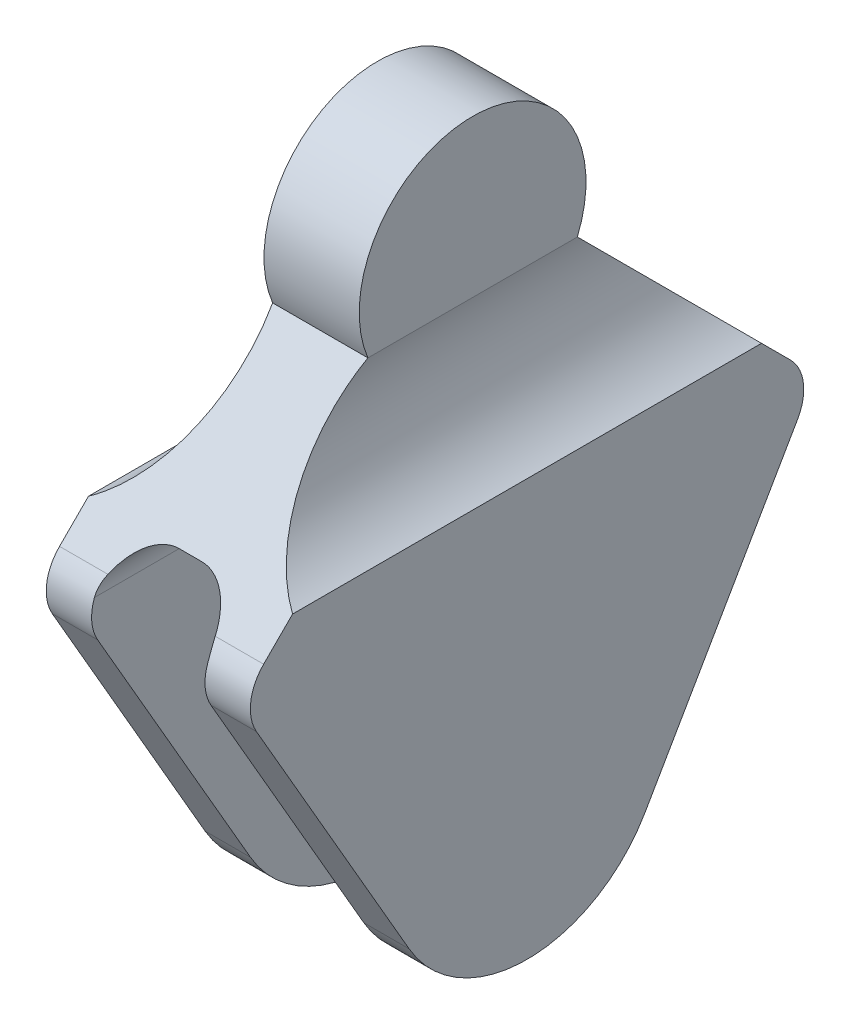
ISO-10303-21;
HEADER;
FILE_DESCRIPTION(('STEP AP214'),'2;1');
FILE_NAME('part.step','',(''),(''),'','','');
FILE_SCHEMA(('AUTOMOTIVE_DESIGN { 1 0 10303 214 1 1 1 1 }'));
ENDSEC;
DATA;
#1=APPLICATION_CONTEXT('core data for automotive mechanical design processes');
#2=APPLICATION_PROTOCOL_DEFINITION('international standard','automotive_design',2000,#1);
#3=PRODUCT_CONTEXT('',#1,'mechanical');
#4=PRODUCT('Part','Part','',(#3));
#5=PRODUCT_RELATED_PRODUCT_CATEGORY('part','',(#4));
#6=PRODUCT_DEFINITION_FORMATION('','',#4);
#7=PRODUCT_DEFINITION_CONTEXT('part definition',#1,'design');
#8=PRODUCT_DEFINITION('design','',#6,#7);
#9=PRODUCT_DEFINITION_SHAPE('','',#8);
#10=(LENGTH_UNIT() NAMED_UNIT(*) SI_UNIT(.MILLI.,.METRE.));
#11=(NAMED_UNIT(*) PLANE_ANGLE_UNIT() SI_UNIT($,.RADIAN.));
#12=(NAMED_UNIT(*) SI_UNIT($,.STERADIAN.) SOLID_ANGLE_UNIT());
#13=UNCERTAINTY_MEASURE_WITH_UNIT(LENGTH_MEASURE(1.E-05),#10,'distance_accuracy_value','');
#14=(GEOMETRIC_REPRESENTATION_CONTEXT(3) GLOBAL_UNCERTAINTY_ASSIGNED_CONTEXT((#13)) GLOBAL_UNIT_ASSIGNED_CONTEXT((#10,
#11,#12)) REPRESENTATION_CONTEXT('',''));
#15=CARTESIAN_POINT('',(0.,0.,0.));
#16=DIRECTION('',(0.,0.,1.));
#17=DIRECTION('',(1.,0.,0.));
#18=AXIS2_PLACEMENT_3D('',#15,#16,#17);
#19=CARTESIAN_POINT('',(-45.,-40.0000000000002,-69.2820323027552));
#20=DIRECTION('',(0.,-0.500000000000001,-0.866025403784438));
#21=DIRECTION('',(0.,0.866025403784438,-0.500000000000002));
#22=AXIS2_PLACEMENT_3D('',#19,#20,#21);
#23=PLANE('',#22);
#24=DIRECTION('',(0.,0.866025403784438,-0.500000000000002));
#25=VECTOR('',#24,1.);
#26=CARTESIAN_POINT('',(-35.,-40.0000000000002,-69.2820323027552));
#27=LINE('',#26,#25);
#28=CARTESIAN_POINT('',(-35.,-115.,-25.9807621135331));
#29=VERTEX_POINT('',#28);
#30=CARTESIAN_POINT('',(-35.,-56.6452466459918,-59.6718946709642));
#31=VERTEX_POINT('',#30);
#32=EDGE_CURVE('E248',#29,#31,#27,.T.);
#33=ORIENTED_EDGE('',*,*,#32,.F.);
#34=DIRECTION('',(1.,0.,0.));
#35=VECTOR('',#34,1.);
#36=CARTESIAN_POINT('',(-45.,-115.,-25.9807621135331));
#37=LINE('',#36,#35);
#38=CARTESIAN_POINT('',(-45.,-115.,-25.9807621135331));
#39=VERTEX_POINT('',#38);
#40=EDGE_CURVE('E65',#39,#29,#37,.T.);
#41=ORIENTED_EDGE('',*,*,#40,.F.);
#42=DIRECTION('',(0.,0.866025403784438,-0.500000000000001));
#43=VECTOR('',#42,1.);
#44=CARTESIAN_POINT('',(-45.,-40.0000000000002,-69.2820323027552));
#45=LINE('',#44,#43);
#46=CARTESIAN_POINT('',(-45.,-56.6452466459918,-59.6718946709642));
#47=VERTEX_POINT('',#46);
#48=EDGE_CURVE('E174',#39,#47,#45,.T.);
#49=ORIENTED_EDGE('',*,*,#48,.T.);
#50=DIRECTION('',(1.,0.,0.));
#51=VECTOR('',#50,1.);
#52=CARTESIAN_POINT('',(-45.,-56.6452466459918,-59.6718946709642));
#53=LINE('',#52,#51);
#54=EDGE_CURVE('E103',#47,#31,#53,.T.);
#55=ORIENTED_EDGE('',*,*,#54,.T.);
#56=EDGE_LOOP('',(#33,#41,#49,#55));
#57=FACE_BOUND('',#56,.T.);
#58=ADVANCED_FACE('F41',(#57),#23,.T.);
#59=CARTESIAN_POINT('',(-45.,-100.,0.));
#60=DIRECTION('',(1.,0.,0.));
#61=DIRECTION('',(0.,0.,-1.));
#62=AXIS2_PLACEMENT_3D('',#59,#60,#61);
#63=CYLINDRICAL_SURFACE('',#62,30.);
#64=ORIENTED_EDGE('',*,*,#40,.T.);
#65=CARTESIAN_POINT('',(-35.,-100.,0.));
#66=DIRECTION('',(-1.,0.,0.));
#67=DIRECTION('',(0.,0.,1.));
#68=AXIS2_PLACEMENT_3D('',#65,#66,#67);
#69=CIRCLE('',#68,30.);
#70=CARTESIAN_POINT('',(-35.,-115.,25.9807621135331));
#71=VERTEX_POINT('',#70);
#72=EDGE_CURVE('E332',#29,#71,#69,.T.);
#73=ORIENTED_EDGE('',*,*,#72,.T.);
#74=DIRECTION('',(1.,0.,0.));
#75=VECTOR('',#74,1.);
#76=CARTESIAN_POINT('',(-45.,-115.,25.9807621135331));
#77=LINE('',#76,#75);
#78=CARTESIAN_POINT('',(-45.,-115.,25.9807621135331));
#79=VERTEX_POINT('',#78);
#80=EDGE_CURVE('E177',#79,#71,#77,.T.);
#81=ORIENTED_EDGE('',*,*,#80,.F.);
#82=CARTESIAN_POINT('',(-45.,-100.,0.));
#83=DIRECTION('',(1.,0.,0.));
#84=DIRECTION('',(0.,0.,-1.));
#85=AXIS2_PLACEMENT_3D('',#82,#83,#84);
#86=CIRCLE('',#85,30.);
#87=EDGE_CURVE('E123',#39,#79,#86,.F.);
#88=ORIENTED_EDGE('',*,*,#87,.F.);
#89=EDGE_LOOP('',(#64,#73,#81,#88));
#90=FACE_BOUND('',#89,.T.);
#91=ADVANCED_FACE('F336',(#90),#63,.T.);
#92=CARTESIAN_POINT('',(-45.,-40.0000000000002,69.2820323027551));
#93=DIRECTION('',(0.,0.500000000000001,-0.866025403784438));
#94=DIRECTION('',(0.,0.866025403784438,0.500000000000001));
#95=AXIS2_PLACEMENT_3D('',#92,#93,#94);
#96=PLANE('',#95);
#97=ORIENTED_EDGE('',*,*,#80,.T.);
#98=DIRECTION('',(0.,0.866025403784438,0.500000000000001));
#99=VECTOR('',#98,1.);
#100=CARTESIAN_POINT('',(-35.,-40.0000000000002,69.2820323027551));
#101=LINE('',#100,#99);
#102=CARTESIAN_POINT('',(-35.,-56.6452466459918,59.6718946709641));
#103=VERTEX_POINT('',#102);
#104=EDGE_CURVE('E134',#71,#103,#101,.T.);
#105=ORIENTED_EDGE('',*,*,#104,.T.);
#106=DIRECTION('',(1.,0.,0.));
#107=VECTOR('',#106,1.);
#108=CARTESIAN_POINT('',(-45.,-56.6452466459918,59.6718946709641));
#109=LINE('',#108,#107);
#110=CARTESIAN_POINT('',(-45.,-56.6452466459918,59.6718946709641));
#111=VERTEX_POINT('',#110);
#112=EDGE_CURVE('E130',#111,#103,#109,.T.);
#113=ORIENTED_EDGE('',*,*,#112,.F.);
#114=DIRECTION('',(0.,0.866025403784438,0.500000000000001));
#115=VECTOR('',#114,1.);
#116=CARTESIAN_POINT('',(-45.,-40.0000000000002,69.2820323027551));
#117=LINE('',#116,#115);
#118=EDGE_CURVE('E115',#79,#111,#117,.T.);
#119=ORIENTED_EDGE('',*,*,#118,.F.);
#120=EDGE_LOOP('',(#97,#105,#113,#119));
#121=FACE_BOUND('',#120,.T.);
#122=ADVANCED_FACE('F131',(#121),#96,.F.);
#123=CARTESIAN_POINT('',(-45.,-51.6452466459918,51.0116406331198));
#124=DIRECTION('',(1.,0.,0.));
#125=DIRECTION('',(0.,0.,-1.));
#126=AXIS2_PLACEMENT_3D('',#123,#124,#125);
#127=CYLINDRICAL_SURFACE('',#126,9.99999999999999);
#128=CARTESIAN_POINT('',(-35.,-51.6452466459918,51.0116406331198));
#129=DIRECTION('',(-1.,0.,0.));
#130=DIRECTION('',(0.,0.,1.));
#131=AXIS2_PLACEMENT_3D('',#128,#129,#130);
#132=CIRCLE('',#131,9.99999999999999);
#133=CARTESIAN_POINT('',(-35.,-48.1927299956433,60.3967420592668));
#134=VERTEX_POINT('',#133);
#135=EDGE_CURVE('E330',#103,#134,#132,.T.);
#136=ORIENTED_EDGE('',*,*,#135,.T.);
#137=CARTESIAN_POINT('',(-35.,-48.1927299956433,60.3967420592668));
#138=CARTESIAN_POINT('',(-35.000001588071,-48.0767720681635,60.3540863224357));
#139=CARTESIAN_POINT('',(-34.9979826676313,-47.9616284641927,60.3092858008696));
#140=CARTESIAN_POINT('',(-34.9900897440527,-47.7332077025527,60.2155087234058));
#141=CARTESIAN_POINT('',(-34.9842163145908,-47.6199302697077,60.1665327898898));
#142=CARTESIAN_POINT('',(-34.9611097809257,-47.2834592795832,60.0136088634734));
#143=CARTESIAN_POINT('',(-34.9383895760264,-47.0633606619864,59.9035666293101));
#144=CARTESIAN_POINT('',(-34.8806172405875,-46.6375163362675,59.6707625039721));
#145=CARTESIAN_POINT('',(-34.8458192477866,-46.4315722785732,59.548296969473));
#146=CARTESIAN_POINT('',(-34.7655763619648,-46.0304756454078,59.2900005296737));
#147=CARTESIAN_POINT('',(-34.7201323215243,-45.8353222073244,59.1541706951479));
#148=CARTESIAN_POINT('',(-34.6202744491076,-45.4561544543122,58.8698480611323));
#149=CARTESIAN_POINT('',(-34.565839711994,-45.272167500225,58.7213261479331));
#150=CARTESIAN_POINT('',(-34.4786084448644,-45.0044833523468,58.4892345058227));
#151=CARTESIAN_POINT('',(-34.4484336093517,-44.9162107704857,58.4098916292835));
#152=CARTESIAN_POINT('',(-34.3865103398098,-44.7428172965294,58.2483872733818));
#153=CARTESIAN_POINT('',(-34.3547615919238,-44.657697039005,58.1662252328586));
#154=CARTESIAN_POINT('',(-34.3223434549197,-44.5741788341263,58.0827084449852));
#155=B_SPLINE_CURVE_WITH_KNOTS('',3,(#137,#138,#139,#140,#141,#142,#143,#144,#145,#146,#147,
#148,#149,#150,#151,#152,#153,#154),.UNSPECIFIED.,.F.,.F.,(4,2,2,2,2,2,2,2,4),(0.,
0.370582268719855,0.74110939517575,1.48131558753879,2.20680649731216,2.93223932656423,
3.65938331016948,4.02670974453567,4.39410972510707),.UNSPECIFIED.);
#156=CARTESIAN_POINT('',(-34.3223434549197,-44.5741788341263,58.0827084449852));
#157=VERTEX_POINT('',#156);
#158=EDGE_CURVE('E242',#134,#157,#155,.T.);
#159=ORIENTED_EDGE('',*,*,#158,.T.);
#160=DIRECTION('',(1.,0.,0.));
#161=VECTOR('',#160,1.);
#162=CARTESIAN_POINT('',(-45.,-44.5741788341263,58.0827084449852));
#163=LINE('',#162,#161);
#164=CARTESIAN_POINT('',(-45.,-44.5741788341263,58.0827084449852));
#165=VERTEX_POINT('',#164);
#166=EDGE_CURVE('E143',#165,#157,#163,.T.);
#167=ORIENTED_EDGE('',*,*,#166,.F.);
#168=CARTESIAN_POINT('',(-45.,-51.6452466459918,51.0116406331198));
#169=DIRECTION('',(1.,0.,0.));
#170=DIRECTION('',(0.,0.,-1.));
#171=AXIS2_PLACEMENT_3D('',#168,#169,#170);
#172=CIRCLE('',#171,9.99999999999999);
#173=EDGE_CURVE('E120',#111,#165,#172,.F.);
#174=ORIENTED_EDGE('',*,*,#173,.F.);
#175=ORIENTED_EDGE('',*,*,#112,.T.);
#176=EDGE_LOOP('',(#136,#159,#167,#174,#175));
#177=FACE_BOUND('',#176,.T.);
#178=ADVANCED_FACE('F140',(#177),#127,.T.);
#179=CARTESIAN_POINT('',(-45.,-51.6452466459918,-51.0116406331198));
#180=DIRECTION('',(1.,0.,0.));
#181=DIRECTION('',(0.,0.,-1.));
#182=AXIS2_PLACEMENT_3D('',#179,#180,#181);
#183=CYLINDRICAL_SURFACE('',#182,10.);
#184=CARTESIAN_POINT('',(-9.99999999999999,-56.6452466459918,-59.6718946709642));
#185=VERTEX_POINT('',#184);
#186=CARTESIAN_POINT('',(0.,-56.6452466459918,-59.6718946709642));
#187=VERTEX_POINT('',#186);
#188=EDGE_CURVE('E152',#185,#187,#53,.T.);
#189=ORIENTED_EDGE('',*,*,#188,.F.);
#190=CARTESIAN_POINT('',(-9.99999999999999,-51.6452466459918,-51.0116406331198));
#191=DIRECTION('',(1.,0.,0.));
#192=DIRECTION('',(0.,0.,-1.));
#193=AXIS2_PLACEMENT_3D('',#190,#191,#192);
#194=CIRCLE('',#193,10.);
#195=CARTESIAN_POINT('',(-9.99999999999999,-48.1927299956433,-60.3967420592668));
#196=VERTEX_POINT('',#195);
#197=EDGE_CURVE('E176',#196,#185,#194,.F.);
#198=ORIENTED_EDGE('',*,*,#197,.F.);
#199=CARTESIAN_POINT('',(-10.6776565450803,-44.5741788341263,-58.0827084449852));
#200=CARTESIAN_POINT('',(-10.612253655837,-44.7426427388478,-58.2511809332734));
#201=CARTESIAN_POINT('',(-10.5495619988574,-44.9177233366595,-58.4142106349615));
#202=CARTESIAN_POINT('',(-10.4314496512366,-45.2808083287477,-58.7286123180632));
#203=CARTESIAN_POINT('',(-10.3760394771662,-45.4688308308411,-58.879967310381));
#204=CARTESIAN_POINT('',(-10.2756442124246,-45.8527694663925,-59.1665979187206));
#205=CARTESIAN_POINT('',(-10.2304579879921,-46.0484237607134,-59.3021523719689));
#206=CARTESIAN_POINT('',(-10.1508393294783,-46.4503274575201,-59.5597245318987));
#207=CARTESIAN_POINT('',(-10.1163982684629,-46.6565682047529,-59.6817530470886));
#208=CARTESIAN_POINT('',(-10.0599675503721,-47.078697860335,-59.9113214062237));
#209=CARTESIAN_POINT('',(-10.0379788042001,-47.2945874732657,-60.0188601897873));
#210=CARTESIAN_POINT('',(-10.0154725703269,-47.6255958956182,-60.1690052268462));
#211=CARTESIAN_POINT('',(-10.009714427812,-47.7377671616408,-60.2174288462831));
#212=CARTESIAN_POINT('',(-10.0019770645786,-47.9639362892968,-60.3101835008153));
#213=CARTESIAN_POINT('',(-9.99999841418935,-48.0779344239897,-60.3545139172818));
#214=CARTESIAN_POINT('',(-9.99999999999999,-48.1927299956433,-60.3967420592668));
#215=B_SPLINE_CURVE_WITH_KNOTS('',3,(#199,#200,#201,#202,#203,#204,#205,#206,#207,#208,#209,
#210,#211,#212,#213,#214),.UNSPECIFIED.,.F.,.F.,(4,2,2,2,2,2,2,4),(0.,0.741155087351997,
1.48336912027627,2.20938434314931,2.93481516355569,3.6602990433396,4.02711375493885,
4.39398381486935),.UNSPECIFIED.);
#216=CARTESIAN_POINT('',(-10.6776565450803,-44.5741788341263,-58.0827084449852));
#217=VERTEX_POINT('',#216);
#218=EDGE_CURVE('E193',#217,#196,#215,.T.);
#219=ORIENTED_EDGE('',*,*,#218,.F.);
#220=DIRECTION('',(1.,0.,0.));
#221=VECTOR('',#220,1.);
#222=CARTESIAN_POINT('',(-45.,-44.5741788341263,-58.0827084449852));
#223=LINE('',#222,#221);
#224=CARTESIAN_POINT('',(0.,-44.5741788341263,-58.0827084449852));
#225=VERTEX_POINT('',#224);
#226=EDGE_CURVE('E190',#217,#225,#223,.T.);
#227=ORIENTED_EDGE('',*,*,#226,.T.);
#228=CARTESIAN_POINT('',(0.,-51.6452466459918,-51.0116406331198));
#229=DIRECTION('',(1.,0.,0.));
#230=DIRECTION('',(0.,0.,-1.));
#231=AXIS2_PLACEMENT_3D('',#228,#229,#230);
#232=CIRCLE('',#231,10.);
#233=EDGE_CURVE('E156',#187,#225,#232,.T.);
#234=ORIENTED_EDGE('',*,*,#233,.F.);
#235=EDGE_LOOP('',(#189,#198,#219,#227,#234));
#236=FACE_BOUND('',#235,.T.);
#237=ADVANCED_FACE('F390',(#236),#183,.T.);
#238=CARTESIAN_POINT('',(-45.,0.,0.));
#239=DIRECTION('',(1.,0.,0.));
#240=DIRECTION('',(0.,0.,-1.));
#241=AXIS2_PLACEMENT_3D('',#238,#239,#240);
#242=PLANE('',#241);
#243=DIRECTION('',(0.,0.707106781186546,-0.707106781186549));
#244=VECTOR('',#243,1.);
#245=CARTESIAN_POINT('',(-45.,6.7542648054294,6.75426480542938));
#246=LINE('',#245,#244);
#247=CARTESIAN_POINT('',(-45.,-38.1927299956434,51.7012596065023));
#248=VERTEX_POINT('',#247);
#249=EDGE_CURVE('E145',#165,#248,#246,.T.);
#250=ORIENTED_EDGE('',*,*,#249,.T.);
#251=DIRECTION('',(0.,0.,1.));
#252=VECTOR('',#251,1.);
#253=CARTESIAN_POINT('',(-45.,-38.1927299956434,-61.0116406331198));
#254=LINE('',#253,#252);
#255=CARTESIAN_POINT('',(-45.,-38.1927299956434,-51.7012596065023));
#256=VERTEX_POINT('',#255);
#257=EDGE_CURVE('E296',#256,#248,#254,.T.);
#258=ORIENTED_EDGE('',*,*,#257,.F.);
#259=DIRECTION('',(0.,0.707106781186546,0.707106781186549));
#260=VECTOR('',#259,1.);
#261=CARTESIAN_POINT('',(-45.,6.7542648054294,-6.75426480542938));
#262=LINE('',#261,#260);
#263=CARTESIAN_POINT('',(-45.,-44.5741788341263,-58.0827084449852));
#264=VERTEX_POINT('',#263);
#265=EDGE_CURVE('E147',#264,#256,#262,.T.);
#266=ORIENTED_EDGE('',*,*,#265,.F.);
#267=CARTESIAN_POINT('',(-45.,-51.6452466459918,-51.0116406331198));
#268=DIRECTION('',(1.,0.,0.));
#269=DIRECTION('',(0.,0.,-1.));
#270=AXIS2_PLACEMENT_3D('',#267,#268,#269);
#271=CIRCLE('',#270,10.);
#272=EDGE_CURVE('E283',#47,#264,#271,.T.);
#273=ORIENTED_EDGE('',*,*,#272,.F.);
#274=ORIENTED_EDGE('',*,*,#48,.F.);
#275=ORIENTED_EDGE('',*,*,#87,.T.);
#276=ORIENTED_EDGE('',*,*,#118,.T.);
#277=ORIENTED_EDGE('',*,*,#173,.T.);
#278=EDGE_LOOP('',(#250,#258,#266,#273,#274,#275,#276,#277));
#279=FACE_BOUND('',#278,.T.);
#280=ADVANCED_FACE('F118',(#279),#242,.F.);
#281=DIRECTION('',(0.,-0.866025403784438,0.500000000000002));
#282=VECTOR('',#281,1.);
#283=CARTESIAN_POINT('',(-9.99999999999999,-40.0000000000002,-69.2820323027552));
#284=LINE('',#283,#282);
#285=CARTESIAN_POINT('',(-9.99999999999999,-115.,-25.9807621135331));
#286=VERTEX_POINT('',#285);
#287=EDGE_CURVE('E280',#185,#286,#284,.T.);
#288=ORIENTED_EDGE('',*,*,#287,.F.);
#289=ORIENTED_EDGE('',*,*,#188,.T.);
#290=DIRECTION('',(0.,0.866025403784438,-0.500000000000001));
#291=VECTOR('',#290,1.);
#292=CARTESIAN_POINT('',(0.,-40.0000000000002,-69.2820323027552));
#293=LINE('',#292,#291);
#294=CARTESIAN_POINT('',(0.,-115.,-25.9807621135331));
#295=VERTEX_POINT('',#294);
#296=EDGE_CURVE('E153',#295,#187,#293,.T.);
#297=ORIENTED_EDGE('',*,*,#296,.F.);
#298=EDGE_CURVE('E94',#286,#295,#37,.T.);
#299=ORIENTED_EDGE('',*,*,#298,.F.);
#300=EDGE_LOOP('',(#288,#289,#297,#299));
#301=FACE_BOUND('',#300,.T.);
#302=ADVANCED_FACE('F43',(#301),#23,.T.);
#303=CARTESIAN_POINT('',(-9.99999999999999,-115.,25.9807621135331));
#304=VERTEX_POINT('',#303);
#305=CARTESIAN_POINT('',(0.,-115.,25.9807621135331));
#306=VERTEX_POINT('',#305);
#307=EDGE_CURVE('E137',#304,#306,#77,.T.);
#308=ORIENTED_EDGE('',*,*,#307,.F.);
#309=CARTESIAN_POINT('',(-9.99999999999999,-100.,0.));
#310=DIRECTION('',(1.,0.,0.));
#311=DIRECTION('',(0.,0.,-1.));
#312=AXIS2_PLACEMENT_3D('',#309,#310,#311);
#313=CIRCLE('',#312,30.);
#314=EDGE_CURVE('E406',#304,#286,#313,.T.);
#315=ORIENTED_EDGE('',*,*,#314,.T.);
#316=ORIENTED_EDGE('',*,*,#298,.T.);
#317=CARTESIAN_POINT('',(0.,-100.,0.));
#318=DIRECTION('',(1.,0.,0.));
#319=DIRECTION('',(0.,0.,-1.));
#320=AXIS2_PLACEMENT_3D('',#317,#318,#319);
#321=CIRCLE('',#320,30.);
#322=EDGE_CURVE('E172',#295,#306,#321,.F.);
#323=ORIENTED_EDGE('',*,*,#322,.T.);
#324=EDGE_LOOP('',(#308,#315,#316,#323));
#325=FACE_BOUND('',#324,.T.);
#326=ADVANCED_FACE('F441',(#325),#63,.T.);
#327=CARTESIAN_POINT('',(-9.99999999999999,-56.6452466459918,59.6718946709641));
#328=VERTEX_POINT('',#327);
#329=CARTESIAN_POINT('',(0.,-56.6452466459918,59.6718946709641));
#330=VERTEX_POINT('',#329);
#331=EDGE_CURVE('E138',#328,#330,#109,.T.);
#332=ORIENTED_EDGE('',*,*,#331,.F.);
#333=DIRECTION('',(0.,-0.866025403784438,-0.500000000000001));
#334=VECTOR('',#333,1.);
#335=CARTESIAN_POINT('',(-9.99999999999999,-40.0000000000002,69.2820323027551));
#336=LINE('',#335,#334);
#337=EDGE_CURVE('E401',#328,#304,#336,.T.);
#338=ORIENTED_EDGE('',*,*,#337,.T.);
#339=ORIENTED_EDGE('',*,*,#307,.T.);
#340=DIRECTION('',(0.,0.866025403784438,0.500000000000001));
#341=VECTOR('',#340,1.);
#342=CARTESIAN_POINT('',(0.,-40.0000000000002,69.2820323027551));
#343=LINE('',#342,#341);
#344=EDGE_CURVE('E169',#306,#330,#343,.T.);
#345=ORIENTED_EDGE('',*,*,#344,.T.);
#346=EDGE_LOOP('',(#332,#338,#339,#345));
#347=FACE_BOUND('',#346,.T.);
#348=ADVANCED_FACE('F236',(#347),#96,.F.);
#349=CARTESIAN_POINT('',(-10.6776565450803,-44.5741788341263,58.0827084449852));
#350=VERTEX_POINT('',#349);
#351=CARTESIAN_POINT('',(0.,-44.5741788341263,58.0827084449852));
#352=VERTEX_POINT('',#351);
#353=EDGE_CURVE('E180',#350,#352,#163,.T.);
#354=ORIENTED_EDGE('',*,*,#353,.F.);
#355=CARTESIAN_POINT('',(-10.6776565450803,-44.5741788341263,58.0827084449852));
#356=CARTESIAN_POINT('',(-10.612253655837,-44.7426427388478,58.2511809332734));
#357=CARTESIAN_POINT('',(-10.5495619988574,-44.9177233366595,58.4142106349615));
#358=CARTESIAN_POINT('',(-10.4314496512366,-45.2808083287477,58.7286123180632));
#359=CARTESIAN_POINT('',(-10.3760394771662,-45.4688308308411,58.879967310381));
#360=CARTESIAN_POINT('',(-10.2756442124246,-45.8527694663925,59.1665979187206));
#361=CARTESIAN_POINT('',(-10.2304579879921,-46.0484237607134,59.3021523719689));
#362=CARTESIAN_POINT('',(-10.1508393294783,-46.4503274575201,59.5597245318986));
#363=CARTESIAN_POINT('',(-10.1163982684629,-46.6565682047529,59.6817530470886));
#364=CARTESIAN_POINT('',(-10.0599675503721,-47.078697860335,59.9113214062237));
#365=CARTESIAN_POINT('',(-10.0379788042001,-47.2945874732657,60.0188601897873));
#366=CARTESIAN_POINT('',(-10.0154725703269,-47.6255958956182,60.1690052268462));
#367=CARTESIAN_POINT('',(-10.009714427812,-47.7377671616408,60.2174288462831));
#368=CARTESIAN_POINT('',(-10.0019770645786,-47.9639362892968,60.3101835008153));
#369=CARTESIAN_POINT('',(-9.99999841418935,-48.0779344239897,60.3545139172818));
#370=CARTESIAN_POINT('',(-9.99999999999999,-48.1927299956433,60.3967420592668));
#371=B_SPLINE_CURVE_WITH_KNOTS('',3,(#355,#356,#357,#358,#359,#360,#361,#362,#363,#364,#365,
#366,#367,#368,#369,#370),.UNSPECIFIED.,.F.,.F.,(4,2,2,2,2,2,2,4),(0.,0.74115508735199,
1.48336912027626,2.20938434314929,2.93481516355567,3.66029904333959,4.02711375493885,
4.39398381486935),.UNSPECIFIED.);
#372=CARTESIAN_POINT('',(-9.99999999999999,-48.1927299956433,60.3967420592668));
#373=VERTEX_POINT('',#372);
#374=EDGE_CURVE('E217',#350,#373,#371,.T.);
#375=ORIENTED_EDGE('',*,*,#374,.T.);
#376=CARTESIAN_POINT('',(-9.99999999999999,-51.6452466459918,51.0116406331198));
#377=DIRECTION('',(1.,0.,0.));
#378=DIRECTION('',(0.,0.,-1.));
#379=AXIS2_PLACEMENT_3D('',#376,#377,#378);
#380=CIRCLE('',#379,9.99999999999999);
#381=EDGE_CURVE('E398',#373,#328,#380,.T.);
#382=ORIENTED_EDGE('',*,*,#381,.T.);
#383=ORIENTED_EDGE('',*,*,#331,.T.);
#384=CARTESIAN_POINT('',(0.,-51.6452466459918,51.0116406331198));
#385=DIRECTION('',(1.,0.,0.));
#386=DIRECTION('',(0.,0.,-1.));
#387=AXIS2_PLACEMENT_3D('',#384,#385,#386);
#388=CIRCLE('',#387,9.99999999999999);
#389=EDGE_CURVE('E166',#330,#352,#388,.F.);
#390=ORIENTED_EDGE('',*,*,#389,.T.);
#391=EDGE_LOOP('',(#354,#375,#382,#383,#390));
#392=FACE_BOUND('',#391,.T.);
#393=ADVANCED_FACE('F230',(#392),#127,.T.);
#394=CARTESIAN_POINT('',(-45.,6.7542648054294,6.75426480542938));
#395=DIRECTION('',(0.,-0.707106781186549,-0.707106781186546));
#396=DIRECTION('',(0.,0.707106781186546,-0.707106781186549));
#397=AXIS2_PLACEMENT_3D('',#394,#395,#396);
#398=PLANE('',#397);
#399=ORIENTED_EDGE('',*,*,#166,.T.);
#400=CARTESIAN_POINT('',(-25.,-48.1927299956433,61.7012596065022));
#401=DIRECTION('',(0.,-0.707106781186549,-0.707106781186546));
#402=DIRECTION('',(0.,-0.707106781186546,0.707106781186549));
#403=AXIS2_PLACEMENT_3D('',#400,#401,#402);
#404=ELLIPSE('',#403,14.142135623731,10.);
#405=CARTESIAN_POINT('',(-24.9999999999999,-38.1927299956433,51.7012596065022));
#406=VERTEX_POINT('',#405);
#407=EDGE_CURVE('E249',#157,#406,#404,.T.);
#408=ORIENTED_EDGE('',*,*,#407,.T.);
#409=DIRECTION('',(1.,0.,0.));
#410=VECTOR('',#409,1.);
#411=CARTESIAN_POINT('',(-45.,-38.1927299956433,51.7012596065022));
#412=LINE('',#411,#410);
#413=CARTESIAN_POINT('',(-20.0000000000001,-38.1927299956433,51.7012596065022));
#414=VERTEX_POINT('',#413);
#415=EDGE_CURVE('E325',#406,#414,#412,.T.);
#416=ORIENTED_EDGE('',*,*,#415,.T.);
#417=CARTESIAN_POINT('',(-20.,-48.1927299956433,61.7012596065022));
#418=DIRECTION('',(0.,-0.707106781186549,-0.707106781186546));
#419=DIRECTION('',(0.,-0.707106781186546,0.707106781186549));
#420=AXIS2_PLACEMENT_3D('',#417,#418,#419);
#421=ELLIPSE('',#420,14.142135623731,10.);
#422=EDGE_CURVE('E227',#414,#350,#421,.T.);
#423=ORIENTED_EDGE('',*,*,#422,.T.);
#424=ORIENTED_EDGE('',*,*,#353,.T.);
#425=DIRECTION('',(0.,0.707106781186546,-0.707106781186549));
#426=VECTOR('',#425,1.);
#427=CARTESIAN_POINT('',(0.,6.7542648054294,6.75426480542938));
#428=LINE('',#427,#426);
#429=CARTESIAN_POINT('',(0.,-38.1927299956434,51.7012596065023));
#430=VERTEX_POINT('',#429);
#431=EDGE_CURVE('E163',#352,#430,#428,.T.);
#432=ORIENTED_EDGE('',*,*,#431,.T.);
#433=CARTESIAN_POINT('',(12.0792399510487,-16.3045605380348,29.8130901488936));
#434=DIRECTION('',(0.,-0.707106781186549,-0.707106781186546));
#435=DIRECTION('',(0.,-0.707106781186546,0.707106781186549));
#436=AXIS2_PLACEMENT_3D('',#433,#434,#435);
#437=ELLIPSE('',#436,35.3553390593274,25.);
#438=CARTESIAN_POINT('',(-12.,-9.58219463161316,23.090724242472));
#439=VERTEX_POINT('',#438);
#440=EDGE_CURVE('E311',#430,#439,#437,.T.);
#441=ORIENTED_EDGE('',*,*,#440,.T.);
#442=DIRECTION('',(1.,0.,0.));
#443=VECTOR('',#442,1.);
#444=CARTESIAN_POINT('',(-45.,-9.58219463161316,23.090724242472));
#445=LINE('',#444,#443);
#446=CARTESIAN_POINT('',(-33.,-9.58219463161316,23.090724242472));
#447=VERTEX_POINT('',#446);
#448=EDGE_CURVE('E181',#447,#439,#445,.T.);
#449=ORIENTED_EDGE('',*,*,#448,.F.);
#450=CARTESIAN_POINT('',(-57.0792399510487,-16.3045605380348,29.8130901488936));
#451=DIRECTION('',(0.,-0.707106781186549,-0.707106781186546));
#452=DIRECTION('',(0.,-0.707106781186546,0.707106781186549));
#453=AXIS2_PLACEMENT_3D('',#450,#451,#452);
#454=ELLIPSE('',#453,35.3553390593274,25.);
#455=EDGE_CURVE('E317',#447,#248,#454,.T.);
#456=ORIENTED_EDGE('',*,*,#455,.T.);
#457=ORIENTED_EDGE('',*,*,#249,.F.);
#458=EDGE_LOOP('',(#399,#408,#416,#423,#424,#432,#441,#449,#456,#457));
#459=FACE_BOUND('',#458,.T.);
#460=ADVANCED_FACE('F235',(#459),#398,.F.);
#461=CARTESIAN_POINT('',(-45.,0.,0.));
#462=DIRECTION('',(1.,0.,0.));
#463=DIRECTION('',(0.,0.,-1.));
#464=AXIS2_PLACEMENT_3D('',#461,#462,#463);
#465=CYLINDRICAL_SURFACE('',#464,25.);
#466=CARTESIAN_POINT('',(-33.,0.,0.));
#467=DIRECTION('',(1.,0.,0.));
#468=DIRECTION('',(0.,0.,-1.));
#469=AXIS2_PLACEMENT_3D('',#466,#467,#468);
#470=CIRCLE('',#469,25.);
#471=CARTESIAN_POINT('',(-33.,-9.58219463161316,-23.090724242472));
#472=VERTEX_POINT('',#471);
#473=EDGE_CURVE('E308',#472,#447,#470,.T.);
#474=ORIENTED_EDGE('',*,*,#473,.T.);
#475=ORIENTED_EDGE('',*,*,#448,.T.);
#476=CARTESIAN_POINT('',(-12.,0.,0.));
#477=DIRECTION('',(1.,0.,0.));
#478=DIRECTION('',(0.,0.,1.));
#479=AXIS2_PLACEMENT_3D('',#476,#477,#478);
#480=CIRCLE('',#479,25.);
#481=CARTESIAN_POINT('',(-12.,-9.58219463161316,-23.090724242472));
#482=VERTEX_POINT('',#481);
#483=EDGE_CURVE('E302',#482,#439,#480,.T.);
#484=ORIENTED_EDGE('',*,*,#483,.F.);
#485=DIRECTION('',(1.,0.,0.));
#486=VECTOR('',#485,1.);
#487=CARTESIAN_POINT('',(-45.,-9.58219463161316,-23.090724242472));
#488=LINE('',#487,#486);
#489=EDGE_CURVE('E184',#472,#482,#488,.T.);
#490=ORIENTED_EDGE('',*,*,#489,.F.);
#491=EDGE_LOOP('',(#474,#475,#484,#490));
#492=FACE_BOUND('',#491,.T.);
#493=ADVANCED_FACE('F371',(#492),#465,.T.);
#494=CARTESIAN_POINT('',(-45.,6.7542648054294,-6.75426480542938));
#495=DIRECTION('',(0.,0.707106781186549,-0.707106781186546));
#496=DIRECTION('',(0.,0.707106781186546,0.707106781186549));
#497=AXIS2_PLACEMENT_3D('',#494,#495,#496);
#498=PLANE('',#497);
#499=CARTESIAN_POINT('',(-25.,-48.1927299956433,-61.7012596065022));
#500=DIRECTION('',(0.,0.707106781186549,-0.707106781186546));
#501=DIRECTION('',(0.,0.707106781186546,0.707106781186549));
#502=AXIS2_PLACEMENT_3D('',#499,#500,#501);
#503=ELLIPSE('',#502,14.142135623731,10.);
#504=CARTESIAN_POINT('',(-34.3223434549197,-44.5741788341263,-58.0827084449852));
#505=VERTEX_POINT('',#504);
#506=CARTESIAN_POINT('',(-24.9999999999999,-38.1927299956433,-51.7012596065022));
#507=VERTEX_POINT('',#506);
#508=EDGE_CURVE('E226',#505,#507,#503,.T.);
#509=ORIENTED_EDGE('',*,*,#508,.F.);
#510=EDGE_CURVE('E187',#264,#505,#223,.T.);
#511=ORIENTED_EDGE('',*,*,#510,.F.);
#512=ORIENTED_EDGE('',*,*,#265,.T.);
#513=CARTESIAN_POINT('',(-57.0792399510487,-16.3045605380348,-29.8130901488936));
#514=DIRECTION('',(0.,0.707106781186549,-0.707106781186546));
#515=DIRECTION('',(0.,0.707106781186546,0.707106781186549));
#516=AXIS2_PLACEMENT_3D('',#513,#514,#515);
#517=ELLIPSE('',#516,35.3553390593274,25.);
#518=EDGE_CURVE('E320',#472,#256,#517,.T.);
#519=ORIENTED_EDGE('',*,*,#518,.F.);
#520=ORIENTED_EDGE('',*,*,#489,.T.);
#521=CARTESIAN_POINT('',(12.0792399510487,-16.3045605380348,-29.8130901488936));
#522=DIRECTION('',(0.,0.707106781186549,-0.707106781186546));
#523=DIRECTION('',(0.,0.707106781186546,0.707106781186549));
#524=AXIS2_PLACEMENT_3D('',#521,#522,#523);
#525=ELLIPSE('',#524,35.3553390593274,25.);
#526=CARTESIAN_POINT('',(0.,-38.1927299956434,-51.7012596065023));
#527=VERTEX_POINT('',#526);
#528=EDGE_CURVE('E314',#527,#482,#525,.T.);
#529=ORIENTED_EDGE('',*,*,#528,.F.);
#530=DIRECTION('',(0.,0.707106781186546,0.707106781186549));
#531=VECTOR('',#530,1.);
#532=CARTESIAN_POINT('',(0.,6.7542648054294,-6.75426480542938));
#533=LINE('',#532,#531);
#534=EDGE_CURVE('E160',#225,#527,#533,.T.);
#535=ORIENTED_EDGE('',*,*,#534,.F.);
#536=ORIENTED_EDGE('',*,*,#226,.F.);
#537=CARTESIAN_POINT('',(-20.,-48.1927299956433,-61.7012596065022));
#538=DIRECTION('',(0.,0.707106781186549,-0.707106781186546));
#539=DIRECTION('',(0.,0.707106781186546,0.707106781186549));
#540=AXIS2_PLACEMENT_3D('',#537,#538,#539);
#541=ELLIPSE('',#540,14.142135623731,10.);
#542=CARTESIAN_POINT('',(-20.0000000000001,-38.1927299956433,-51.7012596065022));
#543=VERTEX_POINT('',#542);
#544=EDGE_CURVE('E384',#543,#217,#541,.T.);
#545=ORIENTED_EDGE('',*,*,#544,.F.);
#546=DIRECTION('',(1.,0.,0.));
#547=VECTOR('',#546,1.);
#548=CARTESIAN_POINT('',(-45.,-38.1927299956432,-51.7012596065022));
#549=LINE('',#548,#547);
#550=EDGE_CURVE('E11',#507,#543,#549,.T.);
#551=ORIENTED_EDGE('',*,*,#550,.F.);
#552=EDGE_LOOP('',(#509,#511,#512,#519,#520,#529,#535,#536,#545,#551));
#553=FACE_BOUND('',#552,.T.);
#554=ADVANCED_FACE('F290',(#553),#498,.T.);
#555=CARTESIAN_POINT('',(-35.,-48.1927299956433,-60.3967420592668));
#556=CARTESIAN_POINT('',(-35.000001588071,-48.0767720681635,-60.3540863224357));
#557=CARTESIAN_POINT('',(-34.9979826676313,-47.9616284641927,-60.3092858008696));
#558=CARTESIAN_POINT('',(-34.9900897440527,-47.7332077025527,-60.2155087234058));
#559=CARTESIAN_POINT('',(-34.9842163145908,-47.6199302697077,-60.1665327898898));
#560=CARTESIAN_POINT('',(-34.9611097809257,-47.2834592795832,-60.0136088634734));
#561=CARTESIAN_POINT('',(-34.9383895760263,-47.0633606619863,-59.9035666293101));
#562=CARTESIAN_POINT('',(-34.8806172405875,-46.6375163362675,-59.6707625039721));
#563=CARTESIAN_POINT('',(-34.8458192477866,-46.4315722785732,-59.548296969473));
#564=CARTESIAN_POINT('',(-34.7655763619648,-46.0304756454078,-59.2900005296737));
#565=CARTESIAN_POINT('',(-34.7201323215243,-45.8353222073244,-59.1541706951479));
#566=CARTESIAN_POINT('',(-34.6202744491076,-45.4561544543122,-58.8698480611323));
#567=CARTESIAN_POINT('',(-34.565839711994,-45.272167500225,-58.7213261479331));
#568=CARTESIAN_POINT('',(-34.4786084448644,-45.0044833523467,-58.4892345058227));
#569=CARTESIAN_POINT('',(-34.4484336093517,-44.9162107704857,-58.4098916292835));
#570=CARTESIAN_POINT('',(-34.3865103398098,-44.7428172965294,-58.2483872733818));
#571=CARTESIAN_POINT('',(-34.3547615919238,-44.657697039005,-58.1662252328586));
#572=CARTESIAN_POINT('',(-34.3223434549197,-44.5741788341263,-58.0827084449852));
#573=B_SPLINE_CURVE_WITH_KNOTS('',3,(#555,#556,#557,#558,#559,#560,#561,#562,#563,#564,#565,
#566,#567,#568,#569,#570,#571,#572),.UNSPECIFIED.,.F.,.F.,(4,2,2,2,2,2,2,2,4),(0.,
0.370582268719852,0.741109395175753,1.4813155875388,2.20680649731216,2.93223932656424,
3.65938331016947,4.02670974453565,4.39410972510707),.UNSPECIFIED.);
#574=CARTESIAN_POINT('',(-35.,-48.1927299956433,-60.3967420592668));
#575=VERTEX_POINT('',#574);
#576=EDGE_CURVE('E49',#575,#505,#573,.T.);
#577=ORIENTED_EDGE('',*,*,#576,.F.);
#578=CARTESIAN_POINT('',(-35.,-51.6452466459918,-51.0116406331198));
#579=DIRECTION('',(-1.,0.,0.));
#580=DIRECTION('',(0.,0.,1.));
#581=AXIS2_PLACEMENT_3D('',#578,#579,#580);
#582=CIRCLE('',#581,10.);
#583=EDGE_CURVE('E200',#31,#575,#582,.F.);
#584=ORIENTED_EDGE('',*,*,#583,.F.);
#585=ORIENTED_EDGE('',*,*,#54,.F.);
#586=ORIENTED_EDGE('',*,*,#272,.T.);
#587=ORIENTED_EDGE('',*,*,#510,.T.);
#588=EDGE_LOOP('',(#577,#584,#585,#586,#587));
#589=FACE_BOUND('',#588,.T.);
#590=ADVANCED_FACE('F201',(#589),#183,.T.);
#591=CARTESIAN_POINT('',(0.,0.,0.));
#592=DIRECTION('',(1.,0.,0.));
#593=DIRECTION('',(0.,0.,-1.));
#594=AXIS2_PLACEMENT_3D('',#591,#592,#593);
#595=PLANE('',#594);
#596=DIRECTION('',(0.,0.,1.));
#597=VECTOR('',#596,1.);
#598=CARTESIAN_POINT('',(0.,-38.1927299956434,-61.0116406331198));
#599=LINE('',#598,#597);
#600=EDGE_CURVE('E323',#527,#430,#599,.T.);
#601=ORIENTED_EDGE('',*,*,#600,.T.);
#602=ORIENTED_EDGE('',*,*,#431,.F.);
#603=ORIENTED_EDGE('',*,*,#389,.F.);
#604=ORIENTED_EDGE('',*,*,#344,.F.);
#605=ORIENTED_EDGE('',*,*,#322,.F.);
#606=ORIENTED_EDGE('',*,*,#296,.T.);
#607=ORIENTED_EDGE('',*,*,#233,.T.);
#608=ORIENTED_EDGE('',*,*,#534,.T.);
#609=EDGE_LOOP('',(#601,#602,#603,#604,#605,#606,#607,#608));
#610=FACE_BOUND('',#609,.T.);
#611=ADVANCED_FACE('F376',(#610),#595,.T.);
#612=CARTESIAN_POINT('',(-12.,0.,0.));
#613=DIRECTION('',(-1.,0.,0.));
#614=DIRECTION('',(0.,0.,1.));
#615=AXIS2_PLACEMENT_3D('',#612,#613,#614);
#616=PLANE('',#615);
#617=ORIENTED_EDGE('',*,*,#483,.T.);
#618=DIRECTION('',(0.,0.,-1.));
#619=VECTOR('',#618,1.);
#620=CARTESIAN_POINT('',(-12.,-9.58219463161316,23.090724242472));
#621=LINE('',#620,#619);
#622=EDGE_CURVE('E157',#439,#482,#621,.T.);
#623=ORIENTED_EDGE('',*,*,#622,.T.);
#624=EDGE_LOOP('',(#617,#623));
#625=FACE_BOUND('',#624,.T.);
#626=ADVANCED_FACE('F370',(#625),#616,.F.);
#627=CARTESIAN_POINT('',(-33.,0.,0.));
#628=DIRECTION('',(1.,0.,0.));
#629=DIRECTION('',(0.,0.,-1.));
#630=AXIS2_PLACEMENT_3D('',#627,#628,#629);
#631=PLANE('',#630);
#632=ORIENTED_EDGE('',*,*,#473,.F.);
#633=DIRECTION('',(0.,0.,-1.));
#634=VECTOR('',#633,1.);
#635=CARTESIAN_POINT('',(-33.,-9.58219463161316,0.));
#636=LINE('',#635,#634);
#637=EDGE_CURVE('E305',#447,#472,#636,.T.);
#638=ORIENTED_EDGE('',*,*,#637,.F.);
#639=EDGE_LOOP('',(#632,#638));
#640=FACE_BOUND('',#639,.T.);
#641=ADVANCED_FACE('F568',(#640),#631,.F.);
#642=CARTESIAN_POINT('',(-57.0792399510487,-16.3045605380348,-61.0116406331198));
#643=DIRECTION('',(0.,0.,1.));
#644=DIRECTION('',(1.,0.,0.));
#645=AXIS2_PLACEMENT_3D('',#642,#643,#644);
#646=CYLINDRICAL_SURFACE('',#645,25.);
#647=ORIENTED_EDGE('',*,*,#637,.T.);
#648=ORIENTED_EDGE('',*,*,#518,.T.);
#649=ORIENTED_EDGE('',*,*,#257,.T.);
#650=ORIENTED_EDGE('',*,*,#455,.F.);
#651=EDGE_LOOP('',(#647,#648,#649,#650));
#652=FACE_BOUND('',#651,.T.);
#653=ADVANCED_FACE('F565',(#652),#646,.F.);
#654=CARTESIAN_POINT('',(12.0792399510487,-16.3045605380348,-61.0116406331198));
#655=DIRECTION('',(0.,0.,1.));
#656=DIRECTION('',(1.,0.,0.));
#657=AXIS2_PLACEMENT_3D('',#654,#655,#656);
#658=CYLINDRICAL_SURFACE('',#657,25.);
#659=ORIENTED_EDGE('',*,*,#600,.F.);
#660=ORIENTED_EDGE('',*,*,#528,.T.);
#661=ORIENTED_EDGE('',*,*,#622,.F.);
#662=ORIENTED_EDGE('',*,*,#440,.F.);
#663=EDGE_LOOP('',(#659,#660,#661,#662));
#664=FACE_BOUND('',#663,.T.);
#665=ADVANCED_FACE('F363',(#664),#658,.F.);
#666=CARTESIAN_POINT('',(-24.9999999999999,-38.1927299956433,-61.0116406331198));
#667=DIRECTION('',(0.,1.,0.));
#668=DIRECTION('',(0.,0.,1.));
#669=AXIS2_PLACEMENT_3D('',#666,#667,#668);
#670=PLANE('',#669);
#671=DIRECTION('',(0.,0.,1.));
#672=VECTOR('',#671,1.);
#673=CARTESIAN_POINT('',(-24.9999999999999,-38.1927299956433,-61.0116406331198));
#674=LINE('',#673,#672);
#675=EDGE_CURVE('E281',#507,#406,#674,.T.);
#676=ORIENTED_EDGE('',*,*,#675,.F.);
#677=ORIENTED_EDGE('',*,*,#550,.T.);
#678=DIRECTION('',(0.,0.,1.));
#679=VECTOR('',#678,1.);
#680=CARTESIAN_POINT('',(-20.0000000000001,-38.1927299956433,-61.0116406331198));
#681=LINE('',#680,#679);
#682=EDGE_CURVE('E397',#543,#414,#681,.T.);
#683=ORIENTED_EDGE('',*,*,#682,.T.);
#684=ORIENTED_EDGE('',*,*,#415,.F.);
#685=EDGE_LOOP('',(#676,#677,#683,#684));
#686=FACE_BOUND('',#685,.T.);
#687=ADVANCED_FACE('F212',(#686),#670,.F.);
#688=CARTESIAN_POINT('',(-35.,-130.192729995643,-61.0116406331198));
#689=DIRECTION('',(-1.,0.,0.));
#690=DIRECTION('',(0.,0.,1.));
#691=AXIS2_PLACEMENT_3D('',#688,#689,#690);
#692=PLANE('',#691);
#693=ORIENTED_EDGE('',*,*,#135,.F.);
#694=ORIENTED_EDGE('',*,*,#104,.F.);
#695=ORIENTED_EDGE('',*,*,#72,.F.);
#696=ORIENTED_EDGE('',*,*,#32,.T.);
#697=ORIENTED_EDGE('',*,*,#583,.T.);
#698=DIRECTION('',(0.,0.,1.));
#699=VECTOR('',#698,1.);
#700=CARTESIAN_POINT('',(-35.,-48.1927299956433,-61.0116406331198));
#701=LINE('',#700,#699);
#702=EDGE_CURVE('E273',#575,#134,#701,.T.);
#703=ORIENTED_EDGE('',*,*,#702,.T.);
#704=EDGE_LOOP('',(#693,#694,#695,#696,#697,#703));
#705=FACE_BOUND('',#704,.T.);
#706=ADVANCED_FACE('F253',(#705),#692,.F.);
#707=CARTESIAN_POINT('',(-25.,-48.1927299956433,-61.0116406331198));
#708=DIRECTION('',(0.,0.,1.));
#709=DIRECTION('',(1.,0.,0.));
#710=AXIS2_PLACEMENT_3D('',#707,#708,#709);
#711=CYLINDRICAL_SURFACE('',#710,10.);
#712=ORIENTED_EDGE('',*,*,#702,.F.);
#713=ORIENTED_EDGE('',*,*,#576,.T.);
#714=ORIENTED_EDGE('',*,*,#508,.T.);
#715=ORIENTED_EDGE('',*,*,#675,.T.);
#716=ORIENTED_EDGE('',*,*,#407,.F.);
#717=ORIENTED_EDGE('',*,*,#158,.F.);
#718=EDGE_LOOP('',(#712,#713,#714,#715,#716,#717));
#719=FACE_BOUND('',#718,.T.);
#720=ADVANCED_FACE('F210',(#719),#711,.F.);
#721=CARTESIAN_POINT('',(-20.,-48.1927299956433,-61.0116406331198));
#722=DIRECTION('',(0.,0.,1.));
#723=DIRECTION('',(1.,0.,0.));
#724=AXIS2_PLACEMENT_3D('',#721,#722,#723);
#725=CYLINDRICAL_SURFACE('',#724,10.);
#726=ORIENTED_EDGE('',*,*,#422,.F.);
#727=ORIENTED_EDGE('',*,*,#682,.F.);
#728=ORIENTED_EDGE('',*,*,#544,.T.);
#729=ORIENTED_EDGE('',*,*,#218,.T.);
#730=DIRECTION('',(0.,0.,1.));
#731=VECTOR('',#730,1.);
#732=CARTESIAN_POINT('',(-9.99999999999999,-48.1927299956433,-61.0116406331198));
#733=LINE('',#732,#731);
#734=EDGE_CURVE('E56',#196,#373,#733,.T.);
#735=ORIENTED_EDGE('',*,*,#734,.T.);
#736=ORIENTED_EDGE('',*,*,#374,.F.);
#737=EDGE_LOOP('',(#726,#727,#728,#729,#735,#736));
#738=FACE_BOUND('',#737,.T.);
#739=ADVANCED_FACE('F204',(#738),#725,.F.);
#740=CARTESIAN_POINT('',(-9.99999999999999,-130.192729995643,-61.0116406331198));
#741=DIRECTION('',(1.,0.,0.));
#742=DIRECTION('',(0.,0.,-1.));
#743=AXIS2_PLACEMENT_3D('',#740,#741,#742);
#744=PLANE('',#743);
#745=ORIENTED_EDGE('',*,*,#734,.F.);
#746=ORIENTED_EDGE('',*,*,#197,.T.);
#747=ORIENTED_EDGE('',*,*,#287,.T.);
#748=ORIENTED_EDGE('',*,*,#314,.F.);
#749=ORIENTED_EDGE('',*,*,#337,.F.);
#750=ORIENTED_EDGE('',*,*,#381,.F.);
#751=EDGE_LOOP('',(#745,#746,#747,#748,#749,#750));
#752=FACE_BOUND('',#751,.T.);
#753=ADVANCED_FACE('F209',(#752),#744,.F.);
#754=CLOSED_SHELL('',(#58,#91,#122,#178,#237,#280,#302,#326,#348,#393,#460,#493,#554,#590,#611,
#626,#641,#653,#665,#687,#706,#720,#739,#753));
#755=MANIFOLD_SOLID_BREP('B2',#754);
#756=ADVANCED_BREP_SHAPE_REPRESENTATION('',(#18,#755),#14);
#757=SHAPE_DEFINITION_REPRESENTATION(#9,#756);
ENDSEC;
END-ISO-10303-21;
